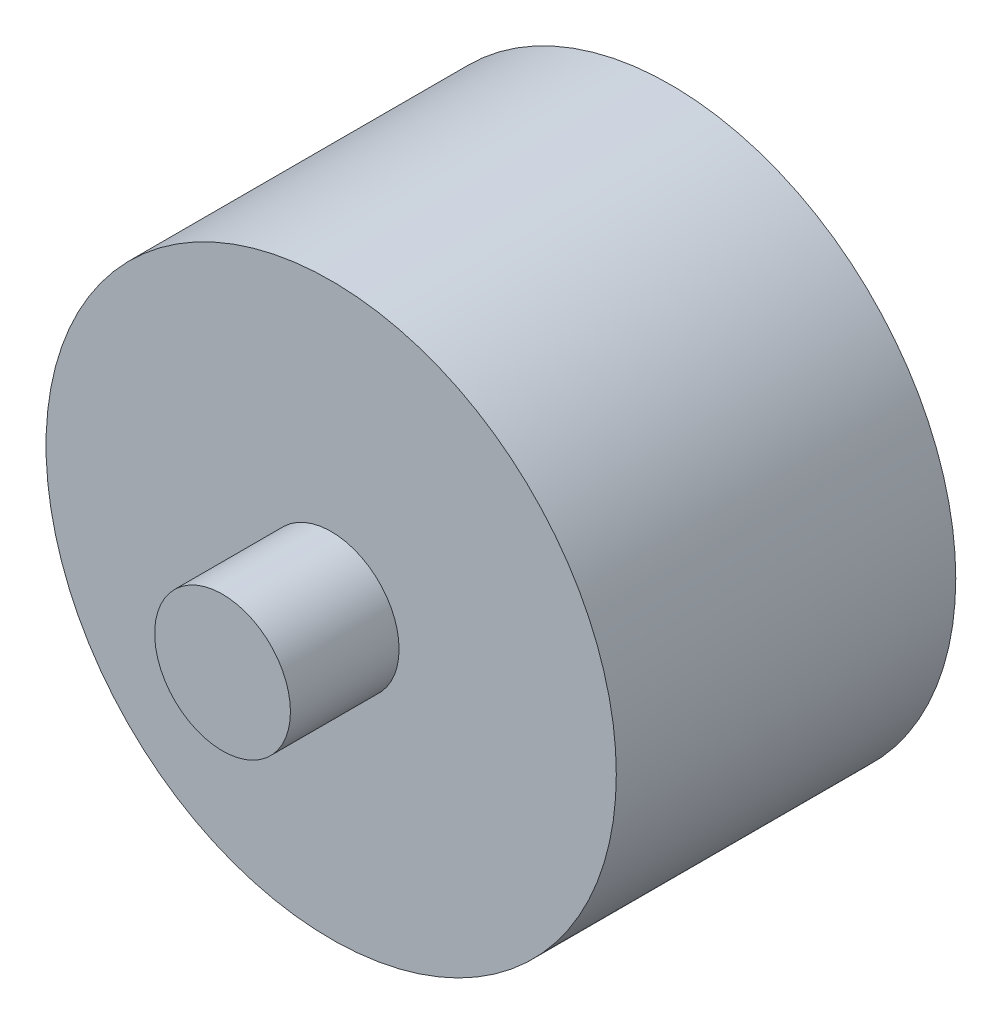
ISO-10303-21;
HEADER;
FILE_DESCRIPTION(('STEP AP214'),'2;1');
FILE_NAME('part.step','',(''),(''),'','','');
FILE_SCHEMA(('AUTOMOTIVE_DESIGN { 1 0 10303 214 1 1 1 1 }'));
ENDSEC;
DATA;
#1=APPLICATION_CONTEXT('core data for automotive mechanical design processes');
#2=APPLICATION_PROTOCOL_DEFINITION('international standard','automotive_design',2000,#1);
#3=PRODUCT_CONTEXT('',#1,'mechanical');
#4=PRODUCT('Part','Part','',(#3));
#5=PRODUCT_RELATED_PRODUCT_CATEGORY('part','',(#4));
#6=PRODUCT_DEFINITION_FORMATION('','',#4);
#7=PRODUCT_DEFINITION_CONTEXT('part definition',#1,'design');
#8=PRODUCT_DEFINITION('design','',#6,#7);
#9=PRODUCT_DEFINITION_SHAPE('','',#8);
#10=(LENGTH_UNIT() NAMED_UNIT(*) SI_UNIT(.MILLI.,.METRE.));
#11=(NAMED_UNIT(*) PLANE_ANGLE_UNIT() SI_UNIT($,.RADIAN.));
#12=(NAMED_UNIT(*) SI_UNIT($,.STERADIAN.) SOLID_ANGLE_UNIT());
#13=UNCERTAINTY_MEASURE_WITH_UNIT(LENGTH_MEASURE(1.E-05),#10,'distance_accuracy_value','');
#14=(GEOMETRIC_REPRESENTATION_CONTEXT(3) GLOBAL_UNCERTAINTY_ASSIGNED_CONTEXT((#13)) GLOBAL_UNIT_ASSIGNED_CONTEXT((#10,
#11,#12)) REPRESENTATION_CONTEXT('',''));
#15=CARTESIAN_POINT('',(0.,0.,0.));
#16=DIRECTION('',(0.,0.,1.));
#17=DIRECTION('',(1.,0.,0.));
#18=AXIS2_PLACEMENT_3D('',#15,#16,#17);
#19=CARTESIAN_POINT('',(0.,0.,-8.));
#20=DIRECTION('',(0.,0.,1.));
#21=DIRECTION('',(1.,0.,0.));
#22=AXIS2_PLACEMENT_3D('',#19,#20,#21);
#23=CYLINDRICAL_SURFACE('',#22,5.);
#24=CARTESIAN_POINT('',(0.,0.,-8.));
#25=DIRECTION('',(0.,0.,-1.));
#26=DIRECTION('',(-1.,0.,0.));
#27=AXIS2_PLACEMENT_3D('',#24,#25,#26);
#28=CIRCLE('',#27,5.);
#29=CARTESIAN_POINT('',(-5.,0.,-8.));
#30=VERTEX_POINT('',#29);
#31=EDGE_CURVE('E11',#30,#30,#28,.T.);
#32=ORIENTED_EDGE('',*,*,#31,.F.);
#33=EDGE_LOOP('',(#32));
#34=FACE_BOUND('',#33,.T.);
#35=CARTESIAN_POINT('',(0.,0.,0.));
#36=DIRECTION('',(0.,0.,-1.));
#37=DIRECTION('',(-1.,0.,0.));
#38=AXIS2_PLACEMENT_3D('',#35,#36,#37);
#39=CIRCLE('',#38,5.);
#40=CARTESIAN_POINT('',(-5.,0.,0.));
#41=VERTEX_POINT('',#40);
#42=EDGE_CURVE('E45',#41,#41,#39,.T.);
#43=ORIENTED_EDGE('',*,*,#42,.T.);
#44=EDGE_LOOP('',(#43));
#45=FACE_BOUND('',#44,.T.);
#46=ADVANCED_FACE('F42',(#34,#45),#23,.T.);
#47=CARTESIAN_POINT('',(0.,0.,-8.));
#48=DIRECTION('',(0.,0.,-1.));
#49=DIRECTION('',(-1.,0.,0.));
#50=AXIS2_PLACEMENT_3D('',#47,#48,#49);
#51=PLANE('',#50);
#52=ORIENTED_EDGE('',*,*,#31,.T.);
#53=EDGE_LOOP('',(#52));
#54=FACE_BOUND('',#53,.T.);
#55=ADVANCED_FACE('F57',(#54),#51,.T.);
#56=CARTESIAN_POINT('',(0.,0.,0.));
#57=DIRECTION('',(0.,0.,-1.));
#58=DIRECTION('',(-1.,0.,0.));
#59=AXIS2_PLACEMENT_3D('',#56,#57,#58);
#60=PLANE('',#59);
#61=ORIENTED_EDGE('',*,*,#42,.F.);
#62=EDGE_LOOP('',(#61));
#63=FACE_BOUND('',#62,.T.);
#64=ADVANCED_FACE('F55',(#63),#60,.F.);
#65=CLOSED_SHELL('',(#46,#55,#64));
#66=MANIFOLD_SOLID_BREP('B2',#65);
#67=CARTESIAN_POINT('',(0.,0.,33.));
#68=DIRECTION('',(0.,0.,-1.));
#69=DIRECTION('',(-1.,0.,0.));
#70=AXIS2_PLACEMENT_3D('',#67,#68,#69);
#71=CYLINDRICAL_SURFACE('',#70,5.);
#72=CARTESIAN_POINT('',(0.,0.,33.));
#73=DIRECTION('',(0.,0.,1.));
#74=DIRECTION('',(1.,0.,0.));
#75=AXIS2_PLACEMENT_3D('',#72,#73,#74);
#76=CIRCLE('',#75,5.);
#77=CARTESIAN_POINT('',(5.,0.,33.));
#78=VERTEX_POINT('',#77);
#79=EDGE_CURVE('E41',#78,#78,#76,.T.);
#80=ORIENTED_EDGE('',*,*,#79,.F.);
#81=EDGE_LOOP('',(#80));
#82=FACE_BOUND('',#81,.T.);
#83=CARTESIAN_POINT('',(0.,0.,25.));
#84=DIRECTION('',(0.,0.,1.));
#85=DIRECTION('',(1.,0.,0.));
#86=AXIS2_PLACEMENT_3D('',#83,#84,#85);
#87=CIRCLE('',#86,5.);
#88=CARTESIAN_POINT('',(5.,0.,25.));
#89=VERTEX_POINT('',#88);
#90=EDGE_CURVE('E93',#89,#89,#87,.T.);
#91=ORIENTED_EDGE('',*,*,#90,.T.);
#92=EDGE_LOOP('',(#91));
#93=FACE_BOUND('',#92,.T.);
#94=ADVANCED_FACE('F90',(#82,#93),#71,.T.);
#95=CARTESIAN_POINT('',(0.,0.,33.));
#96=DIRECTION('',(0.,0.,1.));
#97=DIRECTION('',(1.,0.,0.));
#98=AXIS2_PLACEMENT_3D('',#95,#96,#97);
#99=PLANE('',#98);
#100=ORIENTED_EDGE('',*,*,#79,.T.);
#101=EDGE_LOOP('',(#100));
#102=FACE_BOUND('',#101,.T.);
#103=ADVANCED_FACE('F105',(#102),#99,.T.);
#104=CARTESIAN_POINT('',(0.,0.,25.));
#105=DIRECTION('',(0.,0.,1.));
#106=DIRECTION('',(1.,0.,0.));
#107=AXIS2_PLACEMENT_3D('',#104,#105,#106);
#108=PLANE('',#107);
#109=ORIENTED_EDGE('',*,*,#90,.F.);
#110=EDGE_LOOP('',(#109));
#111=FACE_BOUND('',#110,.T.);
#112=ADVANCED_FACE('F103',(#111),#108,.F.);
#113=CLOSED_SHELL('',(#94,#103,#112));
#114=MANIFOLD_SOLID_BREP('B6',#113);
#115=CARTESIAN_POINT('',(0.,0.,25.));
#116=DIRECTION('',(0.,0.,1.));
#117=DIRECTION('',(1.,0.,0.));
#118=AXIS2_PLACEMENT_3D('',#115,#116,#117);
#119=PLANE('',#118);
#120=CARTESIAN_POINT('',(0.,0.,25.));
#121=DIRECTION('',(0.,0.,1.));
#122=DIRECTION('',(1.,0.,0.));
#123=AXIS2_PLACEMENT_3D('',#120,#121,#122);
#124=CIRCLE('',#123,21.);
#125=CARTESIAN_POINT('',(21.,0.,25.));
#126=VERTEX_POINT('',#125);
#127=EDGE_CURVE('E89',#126,#126,#124,.T.);
#128=ORIENTED_EDGE('',*,*,#127,.T.);
#129=EDGE_LOOP('',(#128));
#130=FACE_BOUND('',#129,.T.);
#131=CARTESIAN_POINT('',(0.,0.,25.));
#132=DIRECTION('',(0.,0.,1.));
#133=DIRECTION('',(1.,0.,0.));
#134=AXIS2_PLACEMENT_3D('',#131,#132,#133);
#135=CIRCLE('',#134,5.);
#136=CARTESIAN_POINT('',(5.,0.,25.));
#137=VERTEX_POINT('',#136);
#138=EDGE_CURVE('E142',#137,#137,#135,.T.);
#139=ORIENTED_EDGE('',*,*,#138,.F.);
#140=EDGE_LOOP('',(#139));
#141=FACE_BOUND('',#140,.T.);
#142=ADVANCED_FACE('F131',(#130,#141),#119,.T.);
#143=CARTESIAN_POINT('',(0.,0.,0.));
#144=DIRECTION('',(0.,0.,1.));
#145=DIRECTION('',(1.,0.,0.));
#146=AXIS2_PLACEMENT_3D('',#143,#144,#145);
#147=PLANE('',#146);
#148=CARTESIAN_POINT('',(0.,0.,0.));
#149=DIRECTION('',(0.,0.,1.));
#150=DIRECTION('',(1.,0.,0.));
#151=AXIS2_PLACEMENT_3D('',#148,#149,#150);
#152=CIRCLE('',#151,21.);
#153=CARTESIAN_POINT('',(21.,0.,0.));
#154=VERTEX_POINT('',#153);
#155=EDGE_CURVE('E135',#154,#154,#152,.T.);
#156=ORIENTED_EDGE('',*,*,#155,.F.);
#157=EDGE_LOOP('',(#156));
#158=FACE_BOUND('',#157,.T.);
#159=CARTESIAN_POINT('',(0.,0.,0.));
#160=DIRECTION('',(0.,0.,1.));
#161=DIRECTION('',(1.,0.,0.));
#162=AXIS2_PLACEMENT_3D('',#159,#160,#161);
#163=CIRCLE('',#162,5.);
#164=CARTESIAN_POINT('',(5.,0.,0.));
#165=VERTEX_POINT('',#164);
#166=EDGE_CURVE('E144',#165,#165,#163,.T.);
#167=ORIENTED_EDGE('',*,*,#166,.T.);
#168=EDGE_LOOP('',(#167));
#169=FACE_BOUND('',#168,.T.);
#170=ADVANCED_FACE('F154',(#158,#169),#147,.F.);
#171=CARTESIAN_POINT('',(0.,0.,25.));
#172=DIRECTION('',(0.,0.,-1.));
#173=DIRECTION('',(-1.,0.,0.));
#174=AXIS2_PLACEMENT_3D('',#171,#172,#173);
#175=CYLINDRICAL_SURFACE('',#174,21.);
#176=ORIENTED_EDGE('',*,*,#127,.F.);
#177=EDGE_LOOP('',(#176));
#178=FACE_BOUND('',#177,.T.);
#179=ORIENTED_EDGE('',*,*,#155,.T.);
#180=EDGE_LOOP('',(#179));
#181=FACE_BOUND('',#180,.T.);
#182=ADVANCED_FACE('F133',(#178,#181),#175,.T.);
#183=CARTESIAN_POINT('',(0.,0.,25.));
#184=DIRECTION('',(0.,0.,-1.));
#185=DIRECTION('',(-1.,0.,0.));
#186=AXIS2_PLACEMENT_3D('',#183,#184,#185);
#187=CYLINDRICAL_SURFACE('',#186,5.);
#188=ORIENTED_EDGE('',*,*,#138,.T.);
#189=EDGE_LOOP('',(#188));
#190=FACE_BOUND('',#189,.T.);
#191=ORIENTED_EDGE('',*,*,#166,.F.);
#192=EDGE_LOOP('',(#191));
#193=FACE_BOUND('',#192,.T.);
#194=ADVANCED_FACE('F150',(#190,#193),#187,.F.);
#195=CLOSED_SHELL('',(#142,#170,#182,#194));
#196=MANIFOLD_SOLID_BREP('B36',#195);
#197=ADVANCED_BREP_SHAPE_REPRESENTATION('',(#18,#66,#114,#196),#14);
#198=SHAPE_DEFINITION_REPRESENTATION(#9,#197);
ENDSEC;
END-ISO-10303-21;
